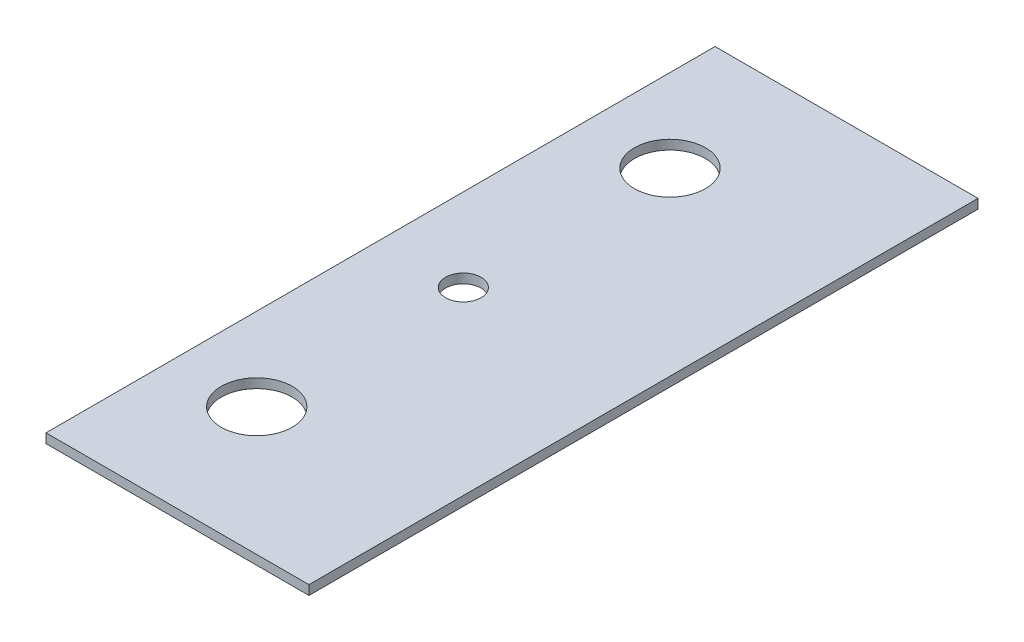
ISO-10303-21;
HEADER;
FILE_DESCRIPTION(('STEP AP214'),'2;1');
FILE_NAME('part.step','',(''),(''),'','','');
FILE_SCHEMA(('AUTOMOTIVE_DESIGN { 1 0 10303 214 1 1 1 1 }'));
ENDSEC;
DATA;
#1=APPLICATION_CONTEXT('core data for automotive mechanical design processes');
#2=APPLICATION_PROTOCOL_DEFINITION('international standard','automotive_design',2000,#1);
#3=PRODUCT_CONTEXT('',#1,'mechanical');
#4=PRODUCT('Part','Part','',(#3));
#5=PRODUCT_RELATED_PRODUCT_CATEGORY('part','',(#4));
#6=PRODUCT_DEFINITION_FORMATION('','',#4);
#7=PRODUCT_DEFINITION_CONTEXT('part definition',#1,'design');
#8=PRODUCT_DEFINITION('design','',#6,#7);
#9=PRODUCT_DEFINITION_SHAPE('','',#8);
#10=(LENGTH_UNIT() NAMED_UNIT(*) SI_UNIT(.MILLI.,.METRE.));
#11=(NAMED_UNIT(*) PLANE_ANGLE_UNIT() SI_UNIT($,.RADIAN.));
#12=(NAMED_UNIT(*) SI_UNIT($,.STERADIAN.) SOLID_ANGLE_UNIT());
#13=UNCERTAINTY_MEASURE_WITH_UNIT(LENGTH_MEASURE(1.E-05),#10,'distance_accuracy_value','');
#14=(GEOMETRIC_REPRESENTATION_CONTEXT(3) GLOBAL_UNCERTAINTY_ASSIGNED_CONTEXT((#13)) GLOBAL_UNIT_ASSIGNED_CONTEXT((#10,
#11,#12)) REPRESENTATION_CONTEXT('',''));
#15=CARTESIAN_POINT('',(0.,0.,0.));
#16=DIRECTION('',(0.,0.,1.));
#17=DIRECTION('',(1.,0.,0.));
#18=AXIS2_PLACEMENT_3D('',#15,#16,#17);
#19=CARTESIAN_POINT('',(0.,0.79375,0.));
#20=DIRECTION('',(0.,1.,0.));
#21=DIRECTION('',(0.,0.,1.));
#22=AXIS2_PLACEMENT_3D('',#19,#20,#21);
#23=PLANE('',#22);
#24=CARTESIAN_POINT('',(89.5021492535202,0.79375,71.8055340200777));
#25=DIRECTION('',(0.,1.,0.));
#26=DIRECTION('',(0.,0.,1.));
#27=AXIS2_PLACEMENT_3D('',#24,#25,#26);
#28=CIRCLE('',#27,3.00000000000001);
#29=CARTESIAN_POINT('',(89.5021492535202,0.79375,74.8055340200777));
#30=VERTEX_POINT('',#29);
#31=EDGE_CURVE('E125',#30,#30,#28,.T.);
#32=ORIENTED_EDGE('',*,*,#31,.F.);
#33=EDGE_LOOP('',(#32));
#34=FACE_BOUND('',#33,.T.);
#35=DIRECTION('',(-1.,0.,0.));
#36=VECTOR('',#35,1.);
#37=CARTESIAN_POINT('',(104.72714925352,0.79375,60.9930340200777));
#38=LINE('',#37,#36);
#39=CARTESIAN_POINT('',(104.72714925352,0.79375,60.9930340200777));
#40=VERTEX_POINT('',#39);
#41=CARTESIAN_POINT('',(82.5021492535202,0.79375,60.9930340200777));
#42=VERTEX_POINT('',#41);
#43=EDGE_CURVE('E95',#40,#42,#38,.T.);
#44=ORIENTED_EDGE('',*,*,#43,.T.);
#45=DIRECTION('',(0.,0.,1.));
#46=VECTOR('',#45,1.);
#47=CARTESIAN_POINT('',(82.5021492535202,0.79375,60.9930340200777));
#48=LINE('',#47,#46);
#49=CARTESIAN_POINT('',(82.5021492535202,0.79375,117.543034020078));
#50=VERTEX_POINT('',#49);
#51=EDGE_CURVE('E90',#42,#50,#48,.T.);
#52=ORIENTED_EDGE('',*,*,#51,.T.);
#53=DIRECTION('',(1.,0.,0.));
#54=VECTOR('',#53,1.);
#55=CARTESIAN_POINT('',(82.5021492535202,0.79375,117.543034020078));
#56=LINE('',#55,#54);
#57=CARTESIAN_POINT('',(104.72714925352,0.79375,117.543034020078));
#58=VERTEX_POINT('',#57);
#59=EDGE_CURVE('E93',#50,#58,#56,.T.);
#60=ORIENTED_EDGE('',*,*,#59,.T.);
#61=DIRECTION('',(0.,0.,-1.));
#62=VECTOR('',#61,1.);
#63=CARTESIAN_POINT('',(104.72714925352,0.79375,117.543034020078));
#64=LINE('',#63,#62);
#65=EDGE_CURVE('E60',#58,#40,#64,.T.);
#66=ORIENTED_EDGE('',*,*,#65,.T.);
#67=EDGE_LOOP('',(#44,#52,#60,#66));
#68=FACE_BOUND('',#67,.T.);
#69=CARTESIAN_POINT('',(89.5021492535202,0.79375,89.2680340200777));
#70=DIRECTION('',(0.,1.,0.));
#71=DIRECTION('',(0.,0.,1.));
#72=AXIS2_PLACEMENT_3D('',#69,#70,#71);
#73=CIRCLE('',#72,1.5);
#74=CARTESIAN_POINT('',(89.5021492535202,0.79375,90.7680340200777));
#75=VERTEX_POINT('',#74);
#76=EDGE_CURVE('E110',#75,#75,#73,.T.);
#77=ORIENTED_EDGE('',*,*,#76,.F.);
#78=EDGE_LOOP('',(#77));
#79=FACE_BOUND('',#78,.T.);
#80=CARTESIAN_POINT('',(89.5021492535202,0.79375,106.730534020078));
#81=DIRECTION('',(0.,1.,0.));
#82=DIRECTION('',(0.,0.,1.));
#83=AXIS2_PLACEMENT_3D('',#80,#81,#82);
#84=CIRCLE('',#83,3.00000000000001);
#85=CARTESIAN_POINT('',(89.5021492535202,0.79375,109.730534020078));
#86=VERTEX_POINT('',#85);
#87=EDGE_CURVE('E131',#86,#86,#84,.T.);
#88=ORIENTED_EDGE('',*,*,#87,.F.);
#89=EDGE_LOOP('',(#88));
#90=FACE_BOUND('',#89,.T.);
#91=ADVANCED_FACE('F43',(#34,#68,#79,#90),#23,.T.);
#92=CARTESIAN_POINT('',(0.,0.,0.));
#93=DIRECTION('',(0.,1.,0.));
#94=DIRECTION('',(0.,0.,1.));
#95=AXIS2_PLACEMENT_3D('',#92,#93,#94);
#96=PLANE('',#95);
#97=DIRECTION('',(-1.,0.,0.));
#98=VECTOR('',#97,1.);
#99=CARTESIAN_POINT('',(104.72714925352,0.,60.9930340200777));
#100=LINE('',#99,#98);
#101=CARTESIAN_POINT('',(104.72714925352,0.,60.9930340200777));
#102=VERTEX_POINT('',#101);
#103=CARTESIAN_POINT('',(82.5021492535202,0.,60.9930340200777));
#104=VERTEX_POINT('',#103);
#105=EDGE_CURVE('E107',#102,#104,#100,.T.);
#106=ORIENTED_EDGE('',*,*,#105,.F.);
#107=DIRECTION('',(0.,0.,-1.));
#108=VECTOR('',#107,1.);
#109=CARTESIAN_POINT('',(104.72714925352,0.,117.543034020078));
#110=LINE('',#109,#108);
#111=CARTESIAN_POINT('',(104.72714925352,0.,117.543034020078));
#112=VERTEX_POINT('',#111);
#113=EDGE_CURVE('E83',#112,#102,#110,.T.);
#114=ORIENTED_EDGE('',*,*,#113,.F.);
#115=DIRECTION('',(1.,0.,0.));
#116=VECTOR('',#115,1.);
#117=CARTESIAN_POINT('',(82.5021492535202,0.,117.543034020078));
#118=LINE('',#117,#116);
#119=CARTESIAN_POINT('',(82.5021492535202,0.,117.543034020078));
#120=VERTEX_POINT('',#119);
#121=EDGE_CURVE('E77',#120,#112,#118,.T.);
#122=ORIENTED_EDGE('',*,*,#121,.F.);
#123=DIRECTION('',(0.,0.,1.));
#124=VECTOR('',#123,1.);
#125=CARTESIAN_POINT('',(82.5021492535202,0.,60.9930340200777));
#126=LINE('',#125,#124);
#127=EDGE_CURVE('E99',#104,#120,#126,.T.);
#128=ORIENTED_EDGE('',*,*,#127,.F.);
#129=EDGE_LOOP('',(#106,#114,#122,#128));
#130=FACE_BOUND('',#129,.T.);
#131=CARTESIAN_POINT('',(89.5021492535202,0.,89.2680340200777));
#132=DIRECTION('',(0.,1.,0.));
#133=DIRECTION('',(0.,0.,1.));
#134=AXIS2_PLACEMENT_3D('',#131,#132,#133);
#135=CIRCLE('',#134,1.5);
#136=CARTESIAN_POINT('',(89.5021492535202,0.,90.7680340200777));
#137=VERTEX_POINT('',#136);
#138=EDGE_CURVE('E122',#137,#137,#135,.T.);
#139=ORIENTED_EDGE('',*,*,#138,.T.);
#140=EDGE_LOOP('',(#139));
#141=FACE_BOUND('',#140,.T.);
#142=CARTESIAN_POINT('',(89.5021492535202,0.,71.8055340200777));
#143=DIRECTION('',(0.,1.,0.));
#144=DIRECTION('',(0.,0.,1.));
#145=AXIS2_PLACEMENT_3D('',#142,#143,#144);
#146=CIRCLE('',#145,3.00000000000001);
#147=CARTESIAN_POINT('',(89.5021492535202,0.,74.8055340200777));
#148=VERTEX_POINT('',#147);
#149=EDGE_CURVE('E128',#148,#148,#146,.T.);
#150=ORIENTED_EDGE('',*,*,#149,.T.);
#151=EDGE_LOOP('',(#150));
#152=FACE_BOUND('',#151,.T.);
#153=CARTESIAN_POINT('',(89.5021492535202,0.,106.730534020078));
#154=DIRECTION('',(0.,1.,0.));
#155=DIRECTION('',(0.,0.,1.));
#156=AXIS2_PLACEMENT_3D('',#153,#154,#155);
#157=CIRCLE('',#156,3.00000000000001);
#158=CARTESIAN_POINT('',(89.5021492535202,0.,109.730534020078));
#159=VERTEX_POINT('',#158);
#160=EDGE_CURVE('E134',#159,#159,#157,.T.);
#161=ORIENTED_EDGE('',*,*,#160,.T.);
#162=EDGE_LOOP('',(#161));
#163=FACE_BOUND('',#162,.T.);
#164=ADVANCED_FACE('F118',(#130,#141,#152,#163),#96,.F.);
#165=CARTESIAN_POINT('',(104.72714925352,0.79375,60.9930340200777));
#166=DIRECTION('',(0.,0.,1.));
#167=DIRECTION('',(1.,0.,0.));
#168=AXIS2_PLACEMENT_3D('',#165,#166,#167);
#169=PLANE('',#168);
#170=ORIENTED_EDGE('',*,*,#105,.T.);
#171=DIRECTION('',(0.,-1.,0.));
#172=VECTOR('',#171,1.);
#173=CARTESIAN_POINT('',(82.5021492535202,0.79375,60.9930340200777));
#174=LINE('',#173,#172);
#175=EDGE_CURVE('E11',#42,#104,#174,.T.);
#176=ORIENTED_EDGE('',*,*,#175,.F.);
#177=ORIENTED_EDGE('',*,*,#43,.F.);
#178=DIRECTION('',(0.,-1.,0.));
#179=VECTOR('',#178,1.);
#180=CARTESIAN_POINT('',(104.72714925352,0.79375,60.9930340200777));
#181=LINE('',#180,#179);
#182=EDGE_CURVE('E103',#40,#102,#181,.T.);
#183=ORIENTED_EDGE('',*,*,#182,.T.);
#184=EDGE_LOOP('',(#170,#176,#177,#183));
#185=FACE_BOUND('',#184,.T.);
#186=ADVANCED_FACE('F45',(#185),#169,.F.);
#187=CARTESIAN_POINT('',(82.5021492535202,0.79375,60.9930340200777));
#188=DIRECTION('',(1.,0.,0.));
#189=DIRECTION('',(0.,0.,-1.));
#190=AXIS2_PLACEMENT_3D('',#187,#188,#189);
#191=PLANE('',#190);
#192=ORIENTED_EDGE('',*,*,#127,.T.);
#193=DIRECTION('',(0.,-1.,0.));
#194=VECTOR('',#193,1.);
#195=CARTESIAN_POINT('',(82.5021492535202,0.79375,117.543034020078));
#196=LINE('',#195,#194);
#197=EDGE_CURVE('E52',#50,#120,#196,.T.);
#198=ORIENTED_EDGE('',*,*,#197,.F.);
#199=ORIENTED_EDGE('',*,*,#51,.F.);
#200=ORIENTED_EDGE('',*,*,#175,.T.);
#201=EDGE_LOOP('',(#192,#198,#199,#200));
#202=FACE_BOUND('',#201,.T.);
#203=ADVANCED_FACE('F98',(#202),#191,.F.);
#204=CARTESIAN_POINT('',(82.5021492535202,0.79375,117.543034020078));
#205=DIRECTION('',(0.,0.,-1.));
#206=DIRECTION('',(-1.,0.,0.));
#207=AXIS2_PLACEMENT_3D('',#204,#205,#206);
#208=PLANE('',#207);
#209=ORIENTED_EDGE('',*,*,#121,.T.);
#210=DIRECTION('',(0.,-1.,0.));
#211=VECTOR('',#210,1.);
#212=CARTESIAN_POINT('',(104.72714925352,0.79375,117.543034020078));
#213=LINE('',#212,#211);
#214=EDGE_CURVE('E100',#58,#112,#213,.T.);
#215=ORIENTED_EDGE('',*,*,#214,.F.);
#216=ORIENTED_EDGE('',*,*,#59,.F.);
#217=ORIENTED_EDGE('',*,*,#197,.T.);
#218=EDGE_LOOP('',(#209,#215,#216,#217));
#219=FACE_BOUND('',#218,.T.);
#220=ADVANCED_FACE('F101',(#219),#208,.F.);
#221=CARTESIAN_POINT('',(104.72714925352,0.79375,117.543034020078));
#222=DIRECTION('',(-1.,0.,0.));
#223=DIRECTION('',(0.,0.,1.));
#224=AXIS2_PLACEMENT_3D('',#221,#222,#223);
#225=PLANE('',#224);
#226=ORIENTED_EDGE('',*,*,#113,.T.);
#227=ORIENTED_EDGE('',*,*,#182,.F.);
#228=ORIENTED_EDGE('',*,*,#65,.F.);
#229=ORIENTED_EDGE('',*,*,#214,.T.);
#230=EDGE_LOOP('',(#226,#227,#228,#229));
#231=FACE_BOUND('',#230,.T.);
#232=ADVANCED_FACE('F115',(#231),#225,.F.);
#233=CARTESIAN_POINT('',(89.5021492535202,0.79375,89.2680340200777));
#234=DIRECTION('',(0.,-1.,0.));
#235=DIRECTION('',(0.,0.,-1.));
#236=AXIS2_PLACEMENT_3D('',#233,#234,#235);
#237=CYLINDRICAL_SURFACE('',#236,1.5);
#238=ORIENTED_EDGE('',*,*,#76,.T.);
#239=EDGE_LOOP('',(#238));
#240=FACE_BOUND('',#239,.T.);
#241=ORIENTED_EDGE('',*,*,#138,.F.);
#242=EDGE_LOOP('',(#241));
#243=FACE_BOUND('',#242,.T.);
#244=ADVANCED_FACE('F152',(#240,#243),#237,.F.);
#245=CARTESIAN_POINT('',(89.5021492535202,0.79375,71.8055340200777));
#246=DIRECTION('',(0.,-1.,0.));
#247=DIRECTION('',(0.,0.,-1.));
#248=AXIS2_PLACEMENT_3D('',#245,#246,#247);
#249=CYLINDRICAL_SURFACE('',#248,3.00000000000001);
#250=ORIENTED_EDGE('',*,*,#31,.T.);
#251=EDGE_LOOP('',(#250));
#252=FACE_BOUND('',#251,.T.);
#253=ORIENTED_EDGE('',*,*,#149,.F.);
#254=EDGE_LOOP('',(#253));
#255=FACE_BOUND('',#254,.T.);
#256=ADVANCED_FACE('F197',(#252,#255),#249,.F.);
#257=CARTESIAN_POINT('',(89.5021492535202,0.79375,106.730534020078));
#258=DIRECTION('',(0.,-1.,0.));
#259=DIRECTION('',(0.,0.,-1.));
#260=AXIS2_PLACEMENT_3D('',#257,#258,#259);
#261=CYLINDRICAL_SURFACE('',#260,3.00000000000001);
#262=ORIENTED_EDGE('',*,*,#87,.T.);
#263=EDGE_LOOP('',(#262));
#264=FACE_BOUND('',#263,.T.);
#265=ORIENTED_EDGE('',*,*,#160,.F.);
#266=EDGE_LOOP('',(#265));
#267=FACE_BOUND('',#266,.T.);
#268=ADVANCED_FACE('F140',(#264,#267),#261,.F.);
#269=CLOSED_SHELL('',(#91,#164,#186,#203,#220,#232,#244,#256,#268));
#270=MANIFOLD_SOLID_BREP('B2',#269);
#271=ADVANCED_BREP_SHAPE_REPRESENTATION('',(#18,#270),#14);
#272=SHAPE_DEFINITION_REPRESENTATION(#9,#271);
ENDSEC;
END-ISO-10303-21;
